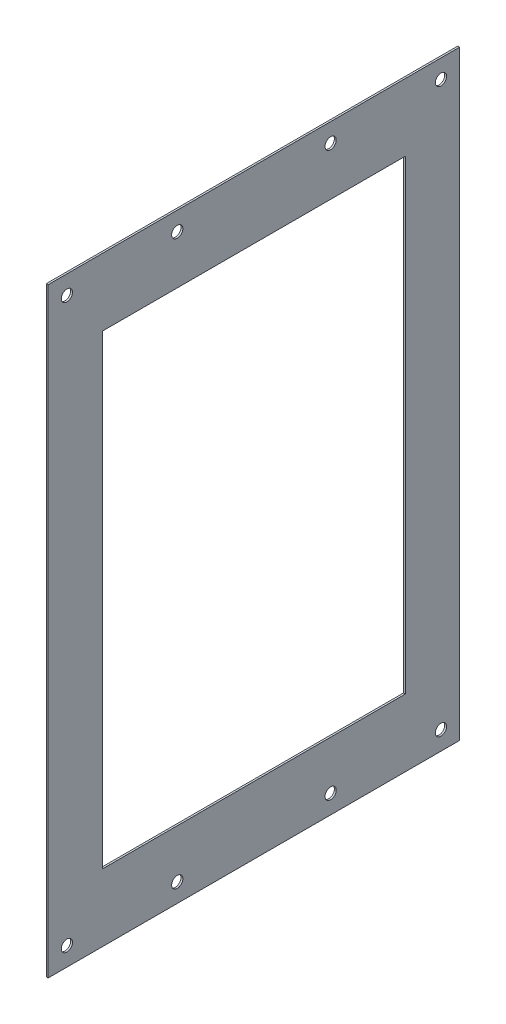
ISO-10303-21;
HEADER;
FILE_DESCRIPTION(('STEP AP214'),'2;1');
FILE_NAME('part.step','',(''),(''),'','','');
FILE_SCHEMA(('AUTOMOTIVE_DESIGN { 1 0 10303 214 1 1 1 1 }'));
ENDSEC;
DATA;
#1=APPLICATION_CONTEXT('core data for automotive mechanical design processes');
#2=APPLICATION_PROTOCOL_DEFINITION('international standard','automotive_design',2000,#1);
#3=PRODUCT_CONTEXT('',#1,'mechanical');
#4=PRODUCT('Part','Part','',(#3));
#5=PRODUCT_RELATED_PRODUCT_CATEGORY('part','',(#4));
#6=PRODUCT_DEFINITION_FORMATION('','',#4);
#7=PRODUCT_DEFINITION_CONTEXT('part definition',#1,'design');
#8=PRODUCT_DEFINITION('design','',#6,#7);
#9=PRODUCT_DEFINITION_SHAPE('','',#8);
#10=(LENGTH_UNIT() NAMED_UNIT(*) SI_UNIT(.MILLI.,.METRE.));
#11=(NAMED_UNIT(*) PLANE_ANGLE_UNIT() SI_UNIT($,.RADIAN.));
#12=(NAMED_UNIT(*) SI_UNIT($,.STERADIAN.) SOLID_ANGLE_UNIT());
#13=UNCERTAINTY_MEASURE_WITH_UNIT(LENGTH_MEASURE(1.E-05),#10,'distance_accuracy_value','');
#14=(GEOMETRIC_REPRESENTATION_CONTEXT(3) GLOBAL_UNCERTAINTY_ASSIGNED_CONTEXT((#13)) GLOBAL_UNIT_ASSIGNED_CONTEXT((#10,
#11,#12)) REPRESENTATION_CONTEXT('',''));
#15=CARTESIAN_POINT('',(0.,0.,0.));
#16=DIRECTION('',(0.,0.,1.));
#17=DIRECTION('',(1.,0.,0.));
#18=AXIS2_PLACEMENT_3D('',#15,#16,#17);
#19=CARTESIAN_POINT('',(1.,160.5,-110.));
#20=DIRECTION('',(0.,-1.,0.));
#21=DIRECTION('',(0.,0.,-1.));
#22=AXIS2_PLACEMENT_3D('',#19,#20,#21);
#23=PLANE('',#22);
#24=DIRECTION('',(0.,0.,1.));
#25=VECTOR('',#24,1.);
#26=CARTESIAN_POINT('',(0.,160.5,-110.));
#27=LINE('',#26,#25);
#28=CARTESIAN_POINT('',(0.,160.5,-110.));
#29=VERTEX_POINT('',#28);
#30=CARTESIAN_POINT('',(0.,160.5,110.));
#31=VERTEX_POINT('',#30);
#32=EDGE_CURVE('E164',#29,#31,#27,.T.);
#33=ORIENTED_EDGE('',*,*,#32,.T.);
#34=DIRECTION('',(-1.,0.,0.));
#35=VECTOR('',#34,1.);
#36=CARTESIAN_POINT('',(1.,160.5,110.));
#37=LINE('',#36,#35);
#38=CARTESIAN_POINT('',(1.,160.5,110.));
#39=VERTEX_POINT('',#38);
#40=EDGE_CURVE('E11',#39,#31,#37,.T.);
#41=ORIENTED_EDGE('',*,*,#40,.F.);
#42=DIRECTION('',(0.,0.,1.));
#43=VECTOR('',#42,1.);
#44=CARTESIAN_POINT('',(1.,160.5,-110.));
#45=LINE('',#44,#43);
#46=CARTESIAN_POINT('',(1.,160.5,-110.));
#47=VERTEX_POINT('',#46);
#48=EDGE_CURVE('E169',#47,#39,#45,.T.);
#49=ORIENTED_EDGE('',*,*,#48,.F.);
#50=DIRECTION('',(-1.,0.,0.));
#51=VECTOR('',#50,1.);
#52=CARTESIAN_POINT('',(1.,160.5,-110.));
#53=LINE('',#52,#51);
#54=EDGE_CURVE('E180',#47,#29,#53,.T.);
#55=ORIENTED_EDGE('',*,*,#54,.T.);
#56=EDGE_LOOP('',(#33,#41,#49,#55));
#57=FACE_BOUND('',#56,.T.);
#58=ADVANCED_FACE('F39',(#57),#23,.F.);
#59=CARTESIAN_POINT('',(1.,-160.5,110.));
#60=DIRECTION('',(0.,0.,-1.));
#61=DIRECTION('',(-1.,0.,0.));
#62=AXIS2_PLACEMENT_3D('',#59,#60,#61);
#63=PLANE('',#62);
#64=DIRECTION('',(0.,-1.,0.));
#65=VECTOR('',#64,1.);
#66=CARTESIAN_POINT('',(0.,-160.5,110.));
#67=LINE('',#66,#65);
#68=CARTESIAN_POINT('',(0.,-160.5,110.));
#69=VERTEX_POINT('',#68);
#70=EDGE_CURVE('E182',#31,#69,#67,.T.);
#71=ORIENTED_EDGE('',*,*,#70,.T.);
#72=DIRECTION('',(-1.,0.,0.));
#73=VECTOR('',#72,1.);
#74=CARTESIAN_POINT('',(1.,-160.5,110.));
#75=LINE('',#74,#73);
#76=CARTESIAN_POINT('',(1.,-160.5,110.));
#77=VERTEX_POINT('',#76);
#78=EDGE_CURVE('E46',#77,#69,#75,.T.);
#79=ORIENTED_EDGE('',*,*,#78,.F.);
#80=DIRECTION('',(0.,-1.,0.));
#81=VECTOR('',#80,1.);
#82=CARTESIAN_POINT('',(1.,-160.5,110.));
#83=LINE('',#82,#81);
#84=EDGE_CURVE('E173',#39,#77,#83,.T.);
#85=ORIENTED_EDGE('',*,*,#84,.F.);
#86=ORIENTED_EDGE('',*,*,#40,.T.);
#87=EDGE_LOOP('',(#71,#79,#85,#86));
#88=FACE_BOUND('',#87,.T.);
#89=ADVANCED_FACE('F209',(#88),#63,.F.);
#90=CARTESIAN_POINT('',(1.,-160.5,-110.));
#91=DIRECTION('',(0.,1.,0.));
#92=DIRECTION('',(0.,0.,1.));
#93=AXIS2_PLACEMENT_3D('',#90,#91,#92);
#94=PLANE('',#93);
#95=DIRECTION('',(0.,0.,-1.));
#96=VECTOR('',#95,1.);
#97=CARTESIAN_POINT('',(0.,-160.5,-110.));
#98=LINE('',#97,#96);
#99=CARTESIAN_POINT('',(0.,-160.5,-110.));
#100=VERTEX_POINT('',#99);
#101=EDGE_CURVE('E181',#69,#100,#98,.T.);
#102=ORIENTED_EDGE('',*,*,#101,.T.);
#103=DIRECTION('',(-1.,0.,0.));
#104=VECTOR('',#103,1.);
#105=CARTESIAN_POINT('',(1.,-160.5,-110.));
#106=LINE('',#105,#104);
#107=CARTESIAN_POINT('',(1.,-160.5,-110.));
#108=VERTEX_POINT('',#107);
#109=EDGE_CURVE('E186',#108,#100,#106,.T.);
#110=ORIENTED_EDGE('',*,*,#109,.F.);
#111=DIRECTION('',(0.,0.,-1.));
#112=VECTOR('',#111,1.);
#113=CARTESIAN_POINT('',(1.,-160.5,-110.));
#114=LINE('',#113,#112);
#115=EDGE_CURVE('E174',#77,#108,#114,.T.);
#116=ORIENTED_EDGE('',*,*,#115,.F.);
#117=ORIENTED_EDGE('',*,*,#78,.T.);
#118=EDGE_LOOP('',(#102,#110,#116,#117));
#119=FACE_BOUND('',#118,.T.);
#120=ADVANCED_FACE('F192',(#119),#94,.F.);
#121=CARTESIAN_POINT('',(1.,-160.5,-110.));
#122=DIRECTION('',(0.,0.,1.));
#123=DIRECTION('',(1.,0.,0.));
#124=AXIS2_PLACEMENT_3D('',#121,#122,#123);
#125=PLANE('',#124);
#126=DIRECTION('',(0.,1.,0.));
#127=VECTOR('',#126,1.);
#128=CARTESIAN_POINT('',(0.,-160.5,-110.));
#129=LINE('',#128,#127);
#130=EDGE_CURVE('E175',#100,#29,#129,.T.);
#131=ORIENTED_EDGE('',*,*,#130,.T.);
#132=ORIENTED_EDGE('',*,*,#54,.F.);
#133=DIRECTION('',(0.,1.,0.));
#134=VECTOR('',#133,1.);
#135=CARTESIAN_POINT('',(1.,-160.5,-110.));
#136=LINE('',#135,#134);
#137=EDGE_CURVE('E179',#108,#47,#136,.T.);
#138=ORIENTED_EDGE('',*,*,#137,.F.);
#139=ORIENTED_EDGE('',*,*,#109,.T.);
#140=EDGE_LOOP('',(#131,#132,#138,#139));
#141=FACE_BOUND('',#140,.T.);
#142=ADVANCED_FACE('F201',(#141),#125,.F.);
#143=CARTESIAN_POINT('',(1.,0.,0.));
#144=DIRECTION('',(-1.,0.,0.));
#145=DIRECTION('',(0.,0.,1.));
#146=AXIS2_PLACEMENT_3D('',#143,#144,#145);
#147=PLANE('',#146);
#148=CARTESIAN_POINT('',(1.,150.5,41.));
#149=DIRECTION('',(1.,0.,0.));
#150=DIRECTION('',(0.,0.,1.));
#151=AXIS2_PLACEMENT_3D('',#148,#149,#150);
#152=CIRCLE('',#151,2.99999999999999);
#153=CARTESIAN_POINT('',(1.,150.5,44.));
#154=VERTEX_POINT('',#153);
#155=EDGE_CURVE('E282',#154,#154,#152,.T.);
#156=ORIENTED_EDGE('',*,*,#155,.F.);
#157=EDGE_LOOP('',(#156));
#158=FACE_BOUND('',#157,.T.);
#159=CARTESIAN_POINT('',(1.,-150.5,-41.0000000000001));
#160=DIRECTION('',(1.,0.,0.));
#161=DIRECTION('',(0.,0.,1.));
#162=AXIS2_PLACEMENT_3D('',#159,#160,#161);
#163=CIRCLE('',#162,2.99999999999999);
#164=CARTESIAN_POINT('',(1.,-150.5,-38.0000000000001));
#165=VERTEX_POINT('',#164);
#166=EDGE_CURVE('E283',#165,#165,#163,.T.);
#167=ORIENTED_EDGE('',*,*,#166,.F.);
#168=EDGE_LOOP('',(#167));
#169=FACE_BOUND('',#168,.T.);
#170=CARTESIAN_POINT('',(1.,150.5,-41.));
#171=DIRECTION('',(1.,0.,0.));
#172=DIRECTION('',(0.,0.,-1.));
#173=AXIS2_PLACEMENT_3D('',#170,#171,#172);
#174=CIRCLE('',#173,2.99999999999999);
#175=CARTESIAN_POINT('',(1.,150.5,-44.));
#176=VERTEX_POINT('',#175);
#177=EDGE_CURVE('E277',#176,#176,#174,.T.);
#178=ORIENTED_EDGE('',*,*,#177,.F.);
#179=EDGE_LOOP('',(#178));
#180=FACE_BOUND('',#179,.T.);
#181=CARTESIAN_POINT('',(1.,-150.5,41.));
#182=DIRECTION('',(1.,0.,0.));
#183=DIRECTION('',(0.,0.,-1.));
#184=AXIS2_PLACEMENT_3D('',#181,#182,#183);
#185=CIRCLE('',#184,2.99999999999999);
#186=CARTESIAN_POINT('',(1.,-150.5,38.));
#187=VERTEX_POINT('',#186);
#188=EDGE_CURVE('E130',#187,#187,#185,.T.);
#189=ORIENTED_EDGE('',*,*,#188,.F.);
#190=EDGE_LOOP('',(#189));
#191=FACE_BOUND('',#190,.T.);
#192=DIRECTION('',(0.,-1.,0.));
#193=VECTOR('',#192,1.);
#194=CARTESIAN_POINT('',(1.,-124.5,81.));
#195=LINE('',#194,#193);
#196=CARTESIAN_POINT('',(1.,124.5,81.));
#197=VERTEX_POINT('',#196);
#198=CARTESIAN_POINT('',(1.,-124.5,81.));
#199=VERTEX_POINT('',#198);
#200=EDGE_CURVE('E131',#197,#199,#195,.T.);
#201=ORIENTED_EDGE('',*,*,#200,.F.);
#202=DIRECTION('',(0.,0.,1.));
#203=VECTOR('',#202,1.);
#204=CARTESIAN_POINT('',(1.,124.5,-81.));
#205=LINE('',#204,#203);
#206=CARTESIAN_POINT('',(1.,124.5,-81.));
#207=VERTEX_POINT('',#206);
#208=EDGE_CURVE('E52',#207,#197,#205,.T.);
#209=ORIENTED_EDGE('',*,*,#208,.F.);
#210=DIRECTION('',(0.,1.,0.));
#211=VECTOR('',#210,1.);
#212=CARTESIAN_POINT('',(1.,-124.5,-81.));
#213=LINE('',#212,#211);
#214=CARTESIAN_POINT('',(1.,-124.5,-81.));
#215=VERTEX_POINT('',#214);
#216=EDGE_CURVE('E124',#215,#207,#213,.T.);
#217=ORIENTED_EDGE('',*,*,#216,.F.);
#218=DIRECTION('',(0.,0.,-1.));
#219=VECTOR('',#218,1.);
#220=CARTESIAN_POINT('',(1.,-124.5,-81.));
#221=LINE('',#220,#219);
#222=EDGE_CURVE('E123',#199,#215,#221,.T.);
#223=ORIENTED_EDGE('',*,*,#222,.F.);
#224=EDGE_LOOP('',(#201,#209,#217,#223));
#225=FACE_BOUND('',#224,.T.);
#226=CARTESIAN_POINT('',(1.,150.5,100.));
#227=DIRECTION('',(1.,0.,0.));
#228=DIRECTION('',(0.,0.,1.));
#229=AXIS2_PLACEMENT_3D('',#226,#227,#228);
#230=CIRCLE('',#229,2.99999999999999);
#231=CARTESIAN_POINT('',(1.,150.5,103.));
#232=VERTEX_POINT('',#231);
#233=EDGE_CURVE('E147',#232,#232,#230,.T.);
#234=ORIENTED_EDGE('',*,*,#233,.F.);
#235=EDGE_LOOP('',(#234));
#236=FACE_BOUND('',#235,.T.);
#237=CARTESIAN_POINT('',(1.,-150.5,-100.));
#238=DIRECTION('',(1.,0.,0.));
#239=DIRECTION('',(0.,0.,1.));
#240=AXIS2_PLACEMENT_3D('',#237,#238,#239);
#241=CIRCLE('',#240,2.99999999999999);
#242=CARTESIAN_POINT('',(1.,-150.5,-97.));
#243=VERTEX_POINT('',#242);
#244=EDGE_CURVE('E160',#243,#243,#241,.T.);
#245=ORIENTED_EDGE('',*,*,#244,.F.);
#246=EDGE_LOOP('',(#245));
#247=FACE_BOUND('',#246,.T.);
#248=CARTESIAN_POINT('',(1.,150.5,-100.));
#249=DIRECTION('',(1.,0.,0.));
#250=DIRECTION('',(0.,0.,-1.));
#251=AXIS2_PLACEMENT_3D('',#248,#249,#250);
#252=CIRCLE('',#251,2.99999999999999);
#253=CARTESIAN_POINT('',(1.,150.5,-103.));
#254=VERTEX_POINT('',#253);
#255=EDGE_CURVE('E145',#254,#254,#252,.T.);
#256=ORIENTED_EDGE('',*,*,#255,.F.);
#257=EDGE_LOOP('',(#256));
#258=FACE_BOUND('',#257,.T.);
#259=CARTESIAN_POINT('',(1.,-150.5,100.));
#260=DIRECTION('',(1.,0.,0.));
#261=DIRECTION('',(0.,0.,-1.));
#262=AXIS2_PLACEMENT_3D('',#259,#260,#261);
#263=CIRCLE('',#262,2.99999999999999);
#264=CARTESIAN_POINT('',(1.,-150.5,97.));
#265=VERTEX_POINT('',#264);
#266=EDGE_CURVE('E153',#265,#265,#263,.T.);
#267=ORIENTED_EDGE('',*,*,#266,.F.);
#268=EDGE_LOOP('',(#267));
#269=FACE_BOUND('',#268,.T.);
#270=ORIENTED_EDGE('',*,*,#48,.T.);
#271=ORIENTED_EDGE('',*,*,#84,.T.);
#272=ORIENTED_EDGE('',*,*,#115,.T.);
#273=ORIENTED_EDGE('',*,*,#137,.T.);
#274=EDGE_LOOP('',(#270,#271,#272,#273));
#275=FACE_BOUND('',#274,.T.);
#276=ADVANCED_FACE('F207',(#158,#169,#180,#191,#225,#236,#247,#258,#269,#275),#147,.F.);
#277=CARTESIAN_POINT('',(0.,0.,0.));
#278=DIRECTION('',(-1.,0.,0.));
#279=DIRECTION('',(0.,0.,1.));
#280=AXIS2_PLACEMENT_3D('',#277,#278,#279);
#281=PLANE('',#280);
#282=CARTESIAN_POINT('',(0.,150.5,41.));
#283=DIRECTION('',(1.,0.,0.));
#284=DIRECTION('',(0.,0.,1.));
#285=AXIS2_PLACEMENT_3D('',#282,#283,#284);
#286=CIRCLE('',#285,2.99999999999999);
#287=CARTESIAN_POINT('',(0.,150.5,44.));
#288=VERTEX_POINT('',#287);
#289=EDGE_CURVE('E290',#288,#288,#286,.T.);
#290=ORIENTED_EDGE('',*,*,#289,.T.);
#291=EDGE_LOOP('',(#290));
#292=FACE_BOUND('',#291,.T.);
#293=CARTESIAN_POINT('',(0.,-150.5,-41.0000000000001));
#294=DIRECTION('',(1.,0.,0.));
#295=DIRECTION('',(0.,0.,1.));
#296=AXIS2_PLACEMENT_3D('',#293,#294,#295);
#297=CIRCLE('',#296,2.99999999999999);
#298=CARTESIAN_POINT('',(0.,-150.5,-38.0000000000001));
#299=VERTEX_POINT('',#298);
#300=EDGE_CURVE('E279',#299,#299,#297,.T.);
#301=ORIENTED_EDGE('',*,*,#300,.T.);
#302=EDGE_LOOP('',(#301));
#303=FACE_BOUND('',#302,.T.);
#304=CARTESIAN_POINT('',(0.,150.5,-41.));
#305=DIRECTION('',(1.,0.,0.));
#306=DIRECTION('',(0.,0.,-1.));
#307=AXIS2_PLACEMENT_3D('',#304,#305,#306);
#308=CIRCLE('',#307,2.99999999999999);
#309=CARTESIAN_POINT('',(0.,150.5,-44.));
#310=VERTEX_POINT('',#309);
#311=EDGE_CURVE('E272',#310,#310,#308,.T.);
#312=ORIENTED_EDGE('',*,*,#311,.T.);
#313=EDGE_LOOP('',(#312));
#314=FACE_BOUND('',#313,.T.);
#315=CARTESIAN_POINT('',(0.,-150.5,41.));
#316=DIRECTION('',(1.,0.,0.));
#317=DIRECTION('',(0.,0.,-1.));
#318=AXIS2_PLACEMENT_3D('',#315,#316,#317);
#319=CIRCLE('',#318,2.99999999999999);
#320=CARTESIAN_POINT('',(0.,-150.5,38.));
#321=VERTEX_POINT('',#320);
#322=EDGE_CURVE('E134',#321,#321,#319,.T.);
#323=ORIENTED_EDGE('',*,*,#322,.T.);
#324=EDGE_LOOP('',(#323));
#325=FACE_BOUND('',#324,.T.);
#326=DIRECTION('',(0.,0.,1.));
#327=VECTOR('',#326,1.);
#328=CARTESIAN_POINT('',(0.,124.5,-81.));
#329=LINE('',#328,#327);
#330=CARTESIAN_POINT('',(0.,124.5,-81.));
#331=VERTEX_POINT('',#330);
#332=CARTESIAN_POINT('',(0.,124.5,81.));
#333=VERTEX_POINT('',#332);
#334=EDGE_CURVE('E104',#331,#333,#329,.T.);
#335=ORIENTED_EDGE('',*,*,#334,.T.);
#336=DIRECTION('',(0.,-1.,0.));
#337=VECTOR('',#336,1.);
#338=CARTESIAN_POINT('',(0.,-124.5,81.));
#339=LINE('',#338,#337);
#340=CARTESIAN_POINT('',(0.,-124.5,81.));
#341=VERTEX_POINT('',#340);
#342=EDGE_CURVE('E111',#333,#341,#339,.T.);
#343=ORIENTED_EDGE('',*,*,#342,.T.);
#344=DIRECTION('',(0.,0.,-1.));
#345=VECTOR('',#344,1.);
#346=CARTESIAN_POINT('',(0.,-124.5,-81.));
#347=LINE('',#346,#345);
#348=CARTESIAN_POINT('',(0.,-124.5,-81.));
#349=VERTEX_POINT('',#348);
#350=EDGE_CURVE('E63',#341,#349,#347,.T.);
#351=ORIENTED_EDGE('',*,*,#350,.T.);
#352=DIRECTION('',(0.,1.,0.));
#353=VECTOR('',#352,1.);
#354=CARTESIAN_POINT('',(0.,-124.5,-81.));
#355=LINE('',#354,#353);
#356=EDGE_CURVE('E112',#349,#331,#355,.T.);
#357=ORIENTED_EDGE('',*,*,#356,.T.);
#358=EDGE_LOOP('',(#335,#343,#351,#357));
#359=FACE_BOUND('',#358,.T.);
#360=CARTESIAN_POINT('',(0.,150.5,100.));
#361=DIRECTION('',(1.,0.,0.));
#362=DIRECTION('',(0.,0.,1.));
#363=AXIS2_PLACEMENT_3D('',#360,#361,#362);
#364=CIRCLE('',#363,2.99999999999999);
#365=CARTESIAN_POINT('',(0.,150.5,103.));
#366=VERTEX_POINT('',#365);
#367=EDGE_CURVE('E152',#366,#366,#364,.T.);
#368=ORIENTED_EDGE('',*,*,#367,.T.);
#369=EDGE_LOOP('',(#368));
#370=FACE_BOUND('',#369,.T.);
#371=CARTESIAN_POINT('',(0.,-150.5,-100.));
#372=DIRECTION('',(1.,0.,0.));
#373=DIRECTION('',(0.,0.,1.));
#374=AXIS2_PLACEMENT_3D('',#371,#372,#373);
#375=CIRCLE('',#374,2.99999999999999);
#376=CARTESIAN_POINT('',(0.,-150.5,-97.));
#377=VERTEX_POINT('',#376);
#378=EDGE_CURVE('E150',#377,#377,#375,.T.);
#379=ORIENTED_EDGE('',*,*,#378,.T.);
#380=EDGE_LOOP('',(#379));
#381=FACE_BOUND('',#380,.T.);
#382=CARTESIAN_POINT('',(0.,150.5,-100.));
#383=DIRECTION('',(1.,0.,0.));
#384=DIRECTION('',(0.,0.,-1.));
#385=AXIS2_PLACEMENT_3D('',#382,#383,#384);
#386=CIRCLE('',#385,2.99999999999999);
#387=CARTESIAN_POINT('',(0.,150.5,-103.));
#388=VERTEX_POINT('',#387);
#389=EDGE_CURVE('E137',#388,#388,#386,.T.);
#390=ORIENTED_EDGE('',*,*,#389,.T.);
#391=EDGE_LOOP('',(#390));
#392=FACE_BOUND('',#391,.T.);
#393=CARTESIAN_POINT('',(0.,-150.5,100.));
#394=DIRECTION('',(1.,0.,0.));
#395=DIRECTION('',(0.,0.,-1.));
#396=AXIS2_PLACEMENT_3D('',#393,#394,#395);
#397=CIRCLE('',#396,2.99999999999999);
#398=CARTESIAN_POINT('',(0.,-150.5,97.));
#399=VERTEX_POINT('',#398);
#400=EDGE_CURVE('E165',#399,#399,#397,.T.);
#401=ORIENTED_EDGE('',*,*,#400,.T.);
#402=EDGE_LOOP('',(#401));
#403=FACE_BOUND('',#402,.T.);
#404=ORIENTED_EDGE('',*,*,#32,.F.);
#405=ORIENTED_EDGE('',*,*,#130,.F.);
#406=ORIENTED_EDGE('',*,*,#101,.F.);
#407=ORIENTED_EDGE('',*,*,#70,.F.);
#408=EDGE_LOOP('',(#404,#405,#406,#407));
#409=FACE_BOUND('',#408,.T.);
#410=ADVANCED_FACE('F116',(#292,#303,#314,#325,#359,#370,#381,#392,#403,#409),#281,.T.);
#411=CARTESIAN_POINT('',(0.,-150.5,100.));
#412=DIRECTION('',(1.,0.,0.));
#413=DIRECTION('',(0.,0.,-1.));
#414=AXIS2_PLACEMENT_3D('',#411,#412,#413);
#415=CYLINDRICAL_SURFACE('',#414,2.99999999999999);
#416=ORIENTED_EDGE('',*,*,#400,.F.);
#417=EDGE_LOOP('',(#416));
#418=FACE_BOUND('',#417,.T.);
#419=ORIENTED_EDGE('',*,*,#266,.T.);
#420=EDGE_LOOP('',(#419));
#421=FACE_BOUND('',#420,.T.);
#422=ADVANCED_FACE('F225',(#418,#421),#415,.F.);
#423=CARTESIAN_POINT('',(0.,150.5,-100.));
#424=DIRECTION('',(1.,0.,0.));
#425=DIRECTION('',(0.,0.,-1.));
#426=AXIS2_PLACEMENT_3D('',#423,#424,#425);
#427=CYLINDRICAL_SURFACE('',#426,2.99999999999999);
#428=ORIENTED_EDGE('',*,*,#389,.F.);
#429=EDGE_LOOP('',(#428));
#430=FACE_BOUND('',#429,.T.);
#431=ORIENTED_EDGE('',*,*,#255,.T.);
#432=EDGE_LOOP('',(#431));
#433=FACE_BOUND('',#432,.T.);
#434=ADVANCED_FACE('F229',(#430,#433),#427,.F.);
#435=CARTESIAN_POINT('',(0.,-150.5,-100.));
#436=DIRECTION('',(1.,0.,0.));
#437=DIRECTION('',(0.,0.,-1.));
#438=AXIS2_PLACEMENT_3D('',#435,#436,#437);
#439=CYLINDRICAL_SURFACE('',#438,2.99999999999999);
#440=ORIENTED_EDGE('',*,*,#378,.F.);
#441=EDGE_LOOP('',(#440));
#442=FACE_BOUND('',#441,.T.);
#443=ORIENTED_EDGE('',*,*,#244,.T.);
#444=EDGE_LOOP('',(#443));
#445=FACE_BOUND('',#444,.T.);
#446=ADVANCED_FACE('F234',(#442,#445),#439,.F.);
#447=CARTESIAN_POINT('',(0.,150.5,100.));
#448=DIRECTION('',(1.,0.,0.));
#449=DIRECTION('',(0.,0.,-1.));
#450=AXIS2_PLACEMENT_3D('',#447,#448,#449);
#451=CYLINDRICAL_SURFACE('',#450,2.99999999999999);
#452=ORIENTED_EDGE('',*,*,#367,.F.);
#453=EDGE_LOOP('',(#452));
#454=FACE_BOUND('',#453,.T.);
#455=ORIENTED_EDGE('',*,*,#233,.T.);
#456=EDGE_LOOP('',(#455));
#457=FACE_BOUND('',#456,.T.);
#458=ADVANCED_FACE('F233',(#454,#457),#451,.F.);
#459=CARTESIAN_POINT('',(0.,124.5,-81.));
#460=DIRECTION('',(0.,1.,0.));
#461=DIRECTION('',(0.,0.,1.));
#462=AXIS2_PLACEMENT_3D('',#459,#460,#461);
#463=PLANE('',#462);
#464=ORIENTED_EDGE('',*,*,#208,.T.);
#465=DIRECTION('',(1.,0.,0.));
#466=VECTOR('',#465,1.);
#467=CARTESIAN_POINT('',(0.,124.5,81.));
#468=LINE('',#467,#466);
#469=EDGE_CURVE('E101',#333,#197,#468,.T.);
#470=ORIENTED_EDGE('',*,*,#469,.F.);
#471=ORIENTED_EDGE('',*,*,#334,.F.);
#472=DIRECTION('',(1.,0.,0.));
#473=VECTOR('',#472,1.);
#474=CARTESIAN_POINT('',(0.,124.5,-81.));
#475=LINE('',#474,#473);
#476=EDGE_CURVE('E140',#331,#207,#475,.T.);
#477=ORIENTED_EDGE('',*,*,#476,.T.);
#478=EDGE_LOOP('',(#464,#470,#471,#477));
#479=FACE_BOUND('',#478,.T.);
#480=ADVANCED_FACE('F103',(#479),#463,.F.);
#481=CARTESIAN_POINT('',(0.,-124.5,-81.));
#482=DIRECTION('',(0.,0.,-1.));
#483=DIRECTION('',(-1.,0.,0.));
#484=AXIS2_PLACEMENT_3D('',#481,#482,#483);
#485=PLANE('',#484);
#486=ORIENTED_EDGE('',*,*,#216,.T.);
#487=ORIENTED_EDGE('',*,*,#476,.F.);
#488=ORIENTED_EDGE('',*,*,#356,.F.);
#489=DIRECTION('',(1.,0.,0.));
#490=VECTOR('',#489,1.);
#491=CARTESIAN_POINT('',(0.,-124.5,-81.));
#492=LINE('',#491,#490);
#493=EDGE_CURVE('E143',#349,#215,#492,.T.);
#494=ORIENTED_EDGE('',*,*,#493,.T.);
#495=EDGE_LOOP('',(#486,#487,#488,#494));
#496=FACE_BOUND('',#495,.T.);
#497=ADVANCED_FACE('F244',(#496),#485,.F.);
#498=CARTESIAN_POINT('',(0.,-124.5,-81.));
#499=DIRECTION('',(0.,-1.,0.));
#500=DIRECTION('',(0.,0.,-1.));
#501=AXIS2_PLACEMENT_3D('',#498,#499,#500);
#502=PLANE('',#501);
#503=ORIENTED_EDGE('',*,*,#222,.T.);
#504=ORIENTED_EDGE('',*,*,#493,.F.);
#505=ORIENTED_EDGE('',*,*,#350,.F.);
#506=DIRECTION('',(1.,0.,0.));
#507=VECTOR('',#506,1.);
#508=CARTESIAN_POINT('',(0.,-124.5,81.));
#509=LINE('',#508,#507);
#510=EDGE_CURVE('E109',#341,#199,#509,.T.);
#511=ORIENTED_EDGE('',*,*,#510,.T.);
#512=EDGE_LOOP('',(#503,#504,#505,#511));
#513=FACE_BOUND('',#512,.T.);
#514=ADVANCED_FACE('F250',(#513),#502,.F.);
#515=CARTESIAN_POINT('',(0.,-124.5,81.));
#516=DIRECTION('',(0.,0.,1.));
#517=DIRECTION('',(1.,0.,0.));
#518=AXIS2_PLACEMENT_3D('',#515,#516,#517);
#519=PLANE('',#518);
#520=ORIENTED_EDGE('',*,*,#200,.T.);
#521=ORIENTED_EDGE('',*,*,#510,.F.);
#522=ORIENTED_EDGE('',*,*,#342,.F.);
#523=ORIENTED_EDGE('',*,*,#469,.T.);
#524=EDGE_LOOP('',(#520,#521,#522,#523));
#525=FACE_BOUND('',#524,.T.);
#526=ADVANCED_FACE('F113',(#525),#519,.F.);
#527=CARTESIAN_POINT('',(0.,-150.5,41.));
#528=DIRECTION('',(1.,0.,0.));
#529=DIRECTION('',(0.,0.,-1.));
#530=AXIS2_PLACEMENT_3D('',#527,#528,#529);
#531=CYLINDRICAL_SURFACE('',#530,2.99999999999999);
#532=ORIENTED_EDGE('',*,*,#322,.F.);
#533=EDGE_LOOP('',(#532));
#534=FACE_BOUND('',#533,.T.);
#535=ORIENTED_EDGE('',*,*,#188,.T.);
#536=EDGE_LOOP('',(#535));
#537=FACE_BOUND('',#536,.T.);
#538=ADVANCED_FACE('F246',(#534,#537),#531,.F.);
#539=CARTESIAN_POINT('',(0.,150.5,-41.));
#540=DIRECTION('',(1.,0.,0.));
#541=DIRECTION('',(0.,0.,-1.));
#542=AXIS2_PLACEMENT_3D('',#539,#540,#541);
#543=CYLINDRICAL_SURFACE('',#542,2.99999999999999);
#544=ORIENTED_EDGE('',*,*,#311,.F.);
#545=EDGE_LOOP('',(#544));
#546=FACE_BOUND('',#545,.T.);
#547=ORIENTED_EDGE('',*,*,#177,.T.);
#548=EDGE_LOOP('',(#547));
#549=FACE_BOUND('',#548,.T.);
#550=ADVANCED_FACE('F258',(#546,#549),#543,.F.);
#551=CARTESIAN_POINT('',(0.,-150.5,-41.0000000000001));
#552=DIRECTION('',(1.,0.,0.));
#553=DIRECTION('',(0.,0.,-1.));
#554=AXIS2_PLACEMENT_3D('',#551,#552,#553);
#555=CYLINDRICAL_SURFACE('',#554,2.99999999999999);
#556=ORIENTED_EDGE('',*,*,#300,.F.);
#557=EDGE_LOOP('',(#556));
#558=FACE_BOUND('',#557,.T.);
#559=ORIENTED_EDGE('',*,*,#166,.T.);
#560=EDGE_LOOP('',(#559));
#561=FACE_BOUND('',#560,.T.);
#562=ADVANCED_FACE('F256',(#558,#561),#555,.F.);
#563=CARTESIAN_POINT('',(0.,150.5,41.));
#564=DIRECTION('',(1.,0.,0.));
#565=DIRECTION('',(0.,0.,-1.));
#566=AXIS2_PLACEMENT_3D('',#563,#564,#565);
#567=CYLINDRICAL_SURFACE('',#566,2.99999999999999);
#568=ORIENTED_EDGE('',*,*,#289,.F.);
#569=EDGE_LOOP('',(#568));
#570=FACE_BOUND('',#569,.T.);
#571=ORIENTED_EDGE('',*,*,#155,.T.);
#572=EDGE_LOOP('',(#571));
#573=FACE_BOUND('',#572,.T.);
#574=ADVANCED_FACE('F261',(#570,#573),#567,.F.);
#575=CLOSED_SHELL('',(#58,#89,#120,#142,#276,#410,#422,#434,#446,#458,#480,#497,#514,#526,#538,
#550,#562,#574));
#576=MANIFOLD_SOLID_BREP('B2',#575);
#577=ADVANCED_BREP_SHAPE_REPRESENTATION('',(#18,#576),#14);
#578=SHAPE_DEFINITION_REPRESENTATION(#9,#577);
ENDSEC;
END-ISO-10303-21;
